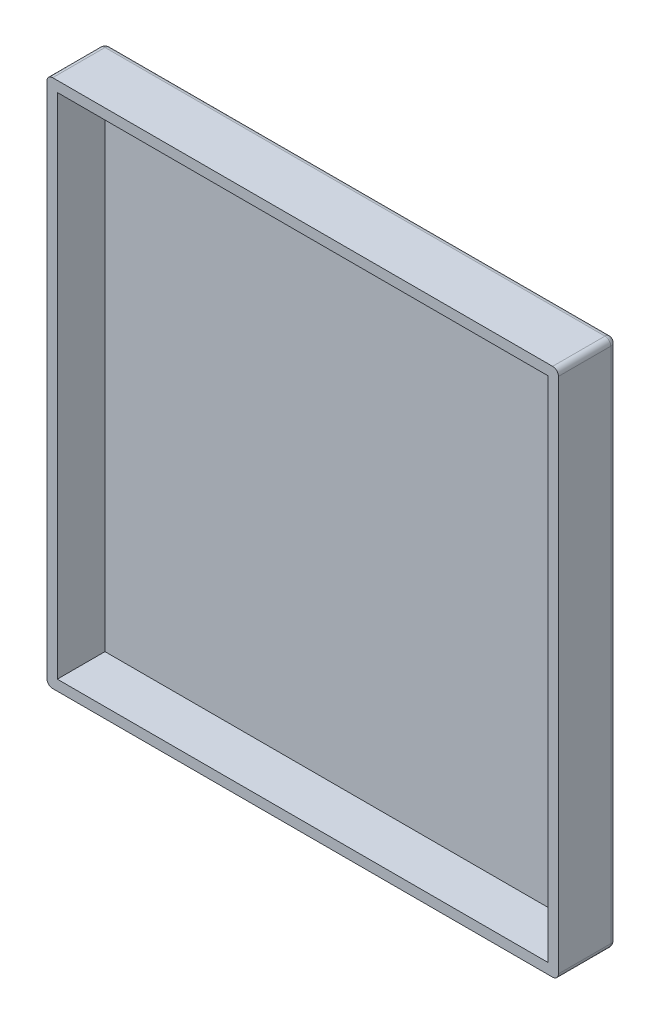
ISO-10303-21;
HEADER;
FILE_DESCRIPTION(('STEP AP214'),'2;1');
FILE_NAME('part.step','',(''),(''),'','','');
FILE_SCHEMA(('AUTOMOTIVE_DESIGN { 1 0 10303 214 1 1 1 1 }'));
ENDSEC;
DATA;
#1=APPLICATION_CONTEXT('core data for automotive mechanical design processes');
#2=APPLICATION_PROTOCOL_DEFINITION('international standard','automotive_design',2000,#1);
#3=PRODUCT_CONTEXT('',#1,'mechanical');
#4=PRODUCT('Part','Part','',(#3));
#5=PRODUCT_RELATED_PRODUCT_CATEGORY('part','',(#4));
#6=PRODUCT_DEFINITION_FORMATION('','',#4);
#7=PRODUCT_DEFINITION_CONTEXT('part definition',#1,'design');
#8=PRODUCT_DEFINITION('design','',#6,#7);
#9=PRODUCT_DEFINITION_SHAPE('','',#8);
#10=(LENGTH_UNIT() NAMED_UNIT(*) SI_UNIT(.MILLI.,.METRE.));
#11=(NAMED_UNIT(*) PLANE_ANGLE_UNIT() SI_UNIT($,.RADIAN.));
#12=(NAMED_UNIT(*) SI_UNIT($,.STERADIAN.) SOLID_ANGLE_UNIT());
#13=UNCERTAINTY_MEASURE_WITH_UNIT(LENGTH_MEASURE(1.E-05),#10,'distance_accuracy_value','');
#14=(GEOMETRIC_REPRESENTATION_CONTEXT(3) GLOBAL_UNCERTAINTY_ASSIGNED_CONTEXT((#13)) GLOBAL_UNIT_ASSIGNED_CONTEXT((#10,
#11,#12)) REPRESENTATION_CONTEXT('',''));
#15=CARTESIAN_POINT('',(0.,0.,0.));
#16=DIRECTION('',(0.,0.,1.));
#17=DIRECTION('',(1.,0.,0.));
#18=AXIS2_PLACEMENT_3D('',#15,#16,#17);
#19=CARTESIAN_POINT('',(0.,0.,10.));
#20=DIRECTION('',(0.,0.,-1.));
#21=DIRECTION('',(-1.,0.,0.));
#22=AXIS2_PLACEMENT_3D('',#19,#20,#21);
#23=PLANE('',#22);
#24=DIRECTION('',(-1.,0.,0.));
#25=VECTOR('',#24,1.);
#26=CARTESIAN_POINT('',(0.,91.,10.));
#27=LINE('',#26,#25);
#28=CARTESIAN_POINT('',(87.,91.,10.));
#29=VERTEX_POINT('',#28);
#30=CARTESIAN_POINT('',(1.,91.,10.));
#31=VERTEX_POINT('',#30);
#32=EDGE_CURVE('E180',#29,#31,#27,.T.);
#33=ORIENTED_EDGE('',*,*,#32,.T.);
#34=CARTESIAN_POINT('',(1.,90.,10.));
#35=DIRECTION('',(0.,0.,-1.));
#36=DIRECTION('',(-1.,0.,0.));
#37=AXIS2_PLACEMENT_3D('',#34,#35,#36);
#38=CIRCLE('',#37,1.);
#39=CARTESIAN_POINT('',(0.,90.,10.));
#40=VERTEX_POINT('',#39);
#41=EDGE_CURVE('E11',#31,#40,#38,.F.);
#42=ORIENTED_EDGE('',*,*,#41,.T.);
#43=DIRECTION('',(0.,-1.,0.));
#44=VECTOR('',#43,1.);
#45=CARTESIAN_POINT('',(0.,0.,10.));
#46=LINE('',#45,#44);
#47=CARTESIAN_POINT('',(0.,1.,10.));
#48=VERTEX_POINT('',#47);
#49=EDGE_CURVE('E171',#40,#48,#46,.T.);
#50=ORIENTED_EDGE('',*,*,#49,.T.);
#51=CARTESIAN_POINT('',(1.,1.,10.));
#52=DIRECTION('',(0.,0.,-1.));
#53=DIRECTION('',(-1.,0.,0.));
#54=AXIS2_PLACEMENT_3D('',#51,#52,#53);
#55=CIRCLE('',#54,1.);
#56=CARTESIAN_POINT('',(1.,0.,10.));
#57=VERTEX_POINT('',#56);
#58=EDGE_CURVE('E41',#48,#57,#55,.F.);
#59=ORIENTED_EDGE('',*,*,#58,.T.);
#60=DIRECTION('',(1.,0.,0.));
#61=VECTOR('',#60,1.);
#62=CARTESIAN_POINT('',(0.,0.,10.));
#63=LINE('',#62,#61);
#64=CARTESIAN_POINT('',(87.,0.,10.));
#65=VERTEX_POINT('',#64);
#66=EDGE_CURVE('E174',#57,#65,#63,.T.);
#67=ORIENTED_EDGE('',*,*,#66,.T.);
#68=CARTESIAN_POINT('',(87.,1.,10.));
#69=DIRECTION('',(0.,0.,-1.));
#70=DIRECTION('',(-1.,0.,0.));
#71=AXIS2_PLACEMENT_3D('',#68,#69,#70);
#72=CIRCLE('',#71,1.);
#73=CARTESIAN_POINT('',(88.,1.,10.));
#74=VERTEX_POINT('',#73);
#75=EDGE_CURVE('E217',#65,#74,#72,.F.);
#76=ORIENTED_EDGE('',*,*,#75,.T.);
#77=DIRECTION('',(0.,1.,0.));
#78=VECTOR('',#77,1.);
#79=CARTESIAN_POINT('',(88.,0.,10.));
#80=LINE('',#79,#78);
#81=CARTESIAN_POINT('',(88.,90.,10.));
#82=VERTEX_POINT('',#81);
#83=EDGE_CURVE('E177',#74,#82,#80,.T.);
#84=ORIENTED_EDGE('',*,*,#83,.T.);
#85=CARTESIAN_POINT('',(87.,90.,10.));
#86=DIRECTION('',(0.,0.,-1.));
#87=DIRECTION('',(-1.,0.,0.));
#88=AXIS2_PLACEMENT_3D('',#85,#86,#87);
#89=CIRCLE('',#88,1.);
#90=EDGE_CURVE('E215',#82,#29,#89,.F.);
#91=ORIENTED_EDGE('',*,*,#90,.T.);
#92=EDGE_LOOP('',(#33,#42,#50,#59,#67,#76,#84,#91));
#93=FACE_BOUND('',#92,.T.);
#94=DIRECTION('',(0.,-1.,0.));
#95=VECTOR('',#94,1.);
#96=CARTESIAN_POINT('',(1.8,0.,10.));
#97=LINE('',#96,#95);
#98=CARTESIAN_POINT('',(1.8,89.2,10.));
#99=VERTEX_POINT('',#98);
#100=CARTESIAN_POINT('',(1.8,1.8,10.));
#101=VERTEX_POINT('',#100);
#102=EDGE_CURVE('E160',#99,#101,#97,.T.);
#103=ORIENTED_EDGE('',*,*,#102,.F.);
#104=DIRECTION('',(-1.,0.,0.));
#105=VECTOR('',#104,1.);
#106=CARTESIAN_POINT('',(0.,89.2,10.));
#107=LINE('',#106,#105);
#108=CARTESIAN_POINT('',(86.2,89.2,10.));
#109=VERTEX_POINT('',#108);
#110=EDGE_CURVE('E169',#109,#99,#107,.T.);
#111=ORIENTED_EDGE('',*,*,#110,.F.);
#112=DIRECTION('',(0.,1.,0.));
#113=VECTOR('',#112,1.);
#114=CARTESIAN_POINT('',(86.2,0.,10.));
#115=LINE('',#114,#113);
#116=CARTESIAN_POINT('',(86.2,1.8,10.));
#117=VERTEX_POINT('',#116);
#118=EDGE_CURVE('E167',#117,#109,#115,.T.);
#119=ORIENTED_EDGE('',*,*,#118,.F.);
#120=DIRECTION('',(1.,0.,0.));
#121=VECTOR('',#120,1.);
#122=CARTESIAN_POINT('',(0.,1.8,10.));
#123=LINE('',#122,#121);
#124=EDGE_CURVE('E149',#101,#117,#123,.T.);
#125=ORIENTED_EDGE('',*,*,#124,.F.);
#126=EDGE_LOOP('',(#103,#111,#119,#125));
#127=FACE_BOUND('',#126,.T.);
#128=ADVANCED_FACE('F32',(#93,#127),#23,.F.);
#129=CARTESIAN_POINT('',(0.,0.,10.));
#130=DIRECTION('',(1.,0.,0.));
#131=DIRECTION('',(0.,0.,-1.));
#132=AXIS2_PLACEMENT_3D('',#129,#130,#131);
#133=PLANE('',#132);
#134=ORIENTED_EDGE('',*,*,#49,.F.);
#135=DIRECTION('',(0.,0.,-1.));
#136=VECTOR('',#135,1.);
#137=CARTESIAN_POINT('',(0.,90.,10.));
#138=LINE('',#137,#136);
#139=CARTESIAN_POINT('',(0.,90.,0.999999999999999));
#140=VERTEX_POINT('',#139);
#141=EDGE_CURVE('E49',#40,#140,#138,.T.);
#142=ORIENTED_EDGE('',*,*,#141,.T.);
#143=DIRECTION('',(0.,-1.,0.));
#144=VECTOR('',#143,1.);
#145=CARTESIAN_POINT('',(0.,0.,0.999999999999999));
#146=LINE('',#145,#144);
#147=CARTESIAN_POINT('',(0.,1.,0.999999999999999));
#148=VERTEX_POINT('',#147);
#149=EDGE_CURVE('E54',#140,#148,#146,.T.);
#150=ORIENTED_EDGE('',*,*,#149,.T.);
#151=DIRECTION('',(0.,0.,-1.));
#152=VECTOR('',#151,1.);
#153=CARTESIAN_POINT('',(0.,1.,10.));
#154=LINE('',#153,#152);
#155=EDGE_CURVE('E211',#148,#48,#154,.F.);
#156=ORIENTED_EDGE('',*,*,#155,.T.);
#157=EDGE_LOOP('',(#134,#142,#150,#156));
#158=FACE_BOUND('',#157,.T.);
#159=ADVANCED_FACE('F266',(#158),#133,.F.);
#160=CARTESIAN_POINT('',(0.,0.,10.));
#161=DIRECTION('',(0.,1.,0.));
#162=DIRECTION('',(0.,0.,1.));
#163=AXIS2_PLACEMENT_3D('',#160,#161,#162);
#164=PLANE('',#163);
#165=ORIENTED_EDGE('',*,*,#66,.F.);
#166=DIRECTION('',(0.,0.,-1.));
#167=VECTOR('',#166,1.);
#168=CARTESIAN_POINT('',(1.,0.,10.));
#169=LINE('',#168,#167);
#170=CARTESIAN_POINT('',(1.,0.,0.999999999999999));
#171=VERTEX_POINT('',#170);
#172=EDGE_CURVE('E188',#57,#171,#169,.T.);
#173=ORIENTED_EDGE('',*,*,#172,.T.);
#174=DIRECTION('',(1.,0.,0.));
#175=VECTOR('',#174,1.);
#176=CARTESIAN_POINT('',(88.,0.,0.999999999999999));
#177=LINE('',#176,#175);
#178=CARTESIAN_POINT('',(87.,0.,0.999999999999999));
#179=VERTEX_POINT('',#178);
#180=EDGE_CURVE('E185',#171,#179,#177,.T.);
#181=ORIENTED_EDGE('',*,*,#180,.T.);
#182=DIRECTION('',(0.,0.,-1.));
#183=VECTOR('',#182,1.);
#184=CARTESIAN_POINT('',(87.,0.,10.));
#185=LINE('',#184,#183);
#186=EDGE_CURVE('E183',#179,#65,#185,.F.);
#187=ORIENTED_EDGE('',*,*,#186,.T.);
#188=EDGE_LOOP('',(#165,#173,#181,#187));
#189=FACE_BOUND('',#188,.T.);
#190=ADVANCED_FACE('F272',(#189),#164,.F.);
#191=CARTESIAN_POINT('',(88.,0.,10.));
#192=DIRECTION('',(-1.,0.,0.));
#193=DIRECTION('',(0.,0.,1.));
#194=AXIS2_PLACEMENT_3D('',#191,#192,#193);
#195=PLANE('',#194);
#196=ORIENTED_EDGE('',*,*,#83,.F.);
#197=DIRECTION('',(0.,0.,-1.));
#198=VECTOR('',#197,1.);
#199=CARTESIAN_POINT('',(88.,1.,10.));
#200=LINE('',#199,#198);
#201=CARTESIAN_POINT('',(88.,1.,0.999999999999999));
#202=VERTEX_POINT('',#201);
#203=EDGE_CURVE('E203',#74,#202,#200,.T.);
#204=ORIENTED_EDGE('',*,*,#203,.T.);
#205=DIRECTION('',(0.,1.,0.));
#206=VECTOR('',#205,1.);
#207=CARTESIAN_POINT('',(88.,91.,0.999999999999999));
#208=LINE('',#207,#206);
#209=CARTESIAN_POINT('',(88.,90.,0.999999999999999));
#210=VERTEX_POINT('',#209);
#211=EDGE_CURVE('E201',#202,#210,#208,.T.);
#212=ORIENTED_EDGE('',*,*,#211,.T.);
#213=DIRECTION('',(0.,0.,-1.));
#214=VECTOR('',#213,1.);
#215=CARTESIAN_POINT('',(88.,90.,10.));
#216=LINE('',#215,#214);
#217=EDGE_CURVE('E199',#210,#82,#216,.F.);
#218=ORIENTED_EDGE('',*,*,#217,.T.);
#219=EDGE_LOOP('',(#196,#204,#212,#218));
#220=FACE_BOUND('',#219,.T.);
#221=ADVANCED_FACE('F284',(#220),#195,.F.);
#222=CARTESIAN_POINT('',(0.,91.,10.));
#223=DIRECTION('',(0.,-1.,0.));
#224=DIRECTION('',(0.,0.,-1.));
#225=AXIS2_PLACEMENT_3D('',#222,#223,#224);
#226=PLANE('',#225);
#227=DIRECTION('',(-1.,0.,0.));
#228=VECTOR('',#227,1.);
#229=CARTESIAN_POINT('',(0.,91.,0.999999999999999));
#230=LINE('',#229,#228);
#231=CARTESIAN_POINT('',(87.,91.,0.999999999999999));
#232=VERTEX_POINT('',#231);
#233=CARTESIAN_POINT('',(1.,91.,0.999999999999999));
#234=VERTEX_POINT('',#233);
#235=EDGE_CURVE('E207',#232,#234,#230,.T.);
#236=ORIENTED_EDGE('',*,*,#235,.T.);
#237=DIRECTION('',(0.,0.,-1.));
#238=VECTOR('',#237,1.);
#239=CARTESIAN_POINT('',(1.,91.,10.));
#240=LINE('',#239,#238);
#241=EDGE_CURVE('E209',#234,#31,#240,.F.);
#242=ORIENTED_EDGE('',*,*,#241,.T.);
#243=ORIENTED_EDGE('',*,*,#32,.F.);
#244=DIRECTION('',(0.,0.,-1.));
#245=VECTOR('',#244,1.);
#246=CARTESIAN_POINT('',(87.,91.,10.));
#247=LINE('',#246,#245);
#248=EDGE_CURVE('E205',#29,#232,#247,.T.);
#249=ORIENTED_EDGE('',*,*,#248,.T.);
#250=EDGE_LOOP('',(#236,#242,#243,#249));
#251=FACE_BOUND('',#250,.T.);
#252=ADVANCED_FACE('F280',(#251),#226,.F.);
#253=CARTESIAN_POINT('',(0.,0.,0.));
#254=DIRECTION('',(0.,0.,-1.));
#255=DIRECTION('',(-1.,0.,0.));
#256=AXIS2_PLACEMENT_3D('',#253,#254,#255);
#257=PLANE('',#256);
#258=DIRECTION('',(0.,1.,0.));
#259=VECTOR('',#258,1.);
#260=CARTESIAN_POINT('',(87.,0.,0.));
#261=LINE('',#260,#259);
#262=CARTESIAN_POINT('',(87.,90.,0.));
#263=VERTEX_POINT('',#262);
#264=CARTESIAN_POINT('',(87.,1.,0.));
#265=VERTEX_POINT('',#264);
#266=EDGE_CURVE('E194',#263,#265,#261,.F.);
#267=ORIENTED_EDGE('',*,*,#266,.T.);
#268=DIRECTION('',(1.,0.,0.));
#269=VECTOR('',#268,1.);
#270=CARTESIAN_POINT('',(0.,1.,0.));
#271=LINE('',#270,#269);
#272=CARTESIAN_POINT('',(1.,1.,0.));
#273=VERTEX_POINT('',#272);
#274=EDGE_CURVE('E196',#265,#273,#271,.F.);
#275=ORIENTED_EDGE('',*,*,#274,.T.);
#276=DIRECTION('',(0.,-1.,0.));
#277=VECTOR('',#276,1.);
#278=CARTESIAN_POINT('',(1.,91.,0.));
#279=LINE('',#278,#277);
#280=CARTESIAN_POINT('',(1.,90.,0.));
#281=VERTEX_POINT('',#280);
#282=EDGE_CURVE('E190',#273,#281,#279,.F.);
#283=ORIENTED_EDGE('',*,*,#282,.T.);
#284=DIRECTION('',(-1.,0.,0.));
#285=VECTOR('',#284,1.);
#286=CARTESIAN_POINT('',(88.,90.,0.));
#287=LINE('',#286,#285);
#288=EDGE_CURVE('E192',#281,#263,#287,.F.);
#289=ORIENTED_EDGE('',*,*,#288,.T.);
#290=EDGE_LOOP('',(#267,#275,#283,#289));
#291=FACE_BOUND('',#290,.T.);
#292=ADVANCED_FACE('F277',(#291),#257,.T.);
#293=CARTESIAN_POINT('',(1.8,0.,10.));
#294=DIRECTION('',(1.,0.,0.));
#295=DIRECTION('',(0.,0.,-1.));
#296=AXIS2_PLACEMENT_3D('',#293,#294,#295);
#297=PLANE('',#296);
#298=DIRECTION('',(0.,-1.,0.));
#299=VECTOR('',#298,1.);
#300=CARTESIAN_POINT('',(1.8,0.,1.8));
#301=LINE('',#300,#299);
#302=CARTESIAN_POINT('',(1.8,89.2,1.8));
#303=VERTEX_POINT('',#302);
#304=CARTESIAN_POINT('',(1.8,1.8,1.8));
#305=VERTEX_POINT('',#304);
#306=EDGE_CURVE('E140',#303,#305,#301,.T.);
#307=ORIENTED_EDGE('',*,*,#306,.F.);
#308=DIRECTION('',(0.,0.,-1.));
#309=VECTOR('',#308,1.);
#310=CARTESIAN_POINT('',(1.8,89.2,10.));
#311=LINE('',#310,#309);
#312=EDGE_CURVE('E163',#99,#303,#311,.T.);
#313=ORIENTED_EDGE('',*,*,#312,.F.);
#314=ORIENTED_EDGE('',*,*,#102,.T.);
#315=DIRECTION('',(0.,0.,-1.));
#316=VECTOR('',#315,1.);
#317=CARTESIAN_POINT('',(1.8,1.8,10.));
#318=LINE('',#317,#316);
#319=EDGE_CURVE('E153',#101,#305,#318,.T.);
#320=ORIENTED_EDGE('',*,*,#319,.T.);
#321=EDGE_LOOP('',(#307,#313,#314,#320));
#322=FACE_BOUND('',#321,.T.);
#323=ADVANCED_FACE('F263',(#322),#297,.T.);
#324=CARTESIAN_POINT('',(0.,1.8,10.));
#325=DIRECTION('',(0.,1.,0.));
#326=DIRECTION('',(0.,0.,1.));
#327=AXIS2_PLACEMENT_3D('',#324,#325,#326);
#328=PLANE('',#327);
#329=DIRECTION('',(1.,0.,0.));
#330=VECTOR('',#329,1.);
#331=CARTESIAN_POINT('',(0.,1.8,1.8));
#332=LINE('',#331,#330);
#333=CARTESIAN_POINT('',(86.2,1.8,1.8));
#334=VERTEX_POINT('',#333);
#335=EDGE_CURVE('E133',#305,#334,#332,.T.);
#336=ORIENTED_EDGE('',*,*,#335,.F.);
#337=ORIENTED_EDGE('',*,*,#319,.F.);
#338=ORIENTED_EDGE('',*,*,#124,.T.);
#339=DIRECTION('',(0.,0.,-1.));
#340=VECTOR('',#339,1.);
#341=CARTESIAN_POINT('',(86.2,1.8,10.));
#342=LINE('',#341,#340);
#343=EDGE_CURVE('E146',#117,#334,#342,.T.);
#344=ORIENTED_EDGE('',*,*,#343,.T.);
#345=EDGE_LOOP('',(#336,#337,#338,#344));
#346=FACE_BOUND('',#345,.T.);
#347=ADVANCED_FACE('F147',(#346),#328,.T.);
#348=CARTESIAN_POINT('',(86.2,0.,10.));
#349=DIRECTION('',(-1.,0.,0.));
#350=DIRECTION('',(0.,0.,1.));
#351=AXIS2_PLACEMENT_3D('',#348,#349,#350);
#352=PLANE('',#351);
#353=DIRECTION('',(0.,1.,0.));
#354=VECTOR('',#353,1.);
#355=CARTESIAN_POINT('',(86.2,0.,1.8));
#356=LINE('',#355,#354);
#357=CARTESIAN_POINT('',(86.2,89.2,1.8));
#358=VERTEX_POINT('',#357);
#359=EDGE_CURVE('E137',#334,#358,#356,.T.);
#360=ORIENTED_EDGE('',*,*,#359,.F.);
#361=ORIENTED_EDGE('',*,*,#343,.F.);
#362=ORIENTED_EDGE('',*,*,#118,.T.);
#363=DIRECTION('',(0.,0.,-1.));
#364=VECTOR('',#363,1.);
#365=CARTESIAN_POINT('',(86.2,89.2,10.));
#366=LINE('',#365,#364);
#367=EDGE_CURVE('E154',#109,#358,#366,.T.);
#368=ORIENTED_EDGE('',*,*,#367,.T.);
#369=EDGE_LOOP('',(#360,#361,#362,#368));
#370=FACE_BOUND('',#369,.T.);
#371=ADVANCED_FACE('F156',(#370),#352,.T.);
#372=CARTESIAN_POINT('',(0.,89.2,10.));
#373=DIRECTION('',(0.,-1.,0.));
#374=DIRECTION('',(0.,0.,-1.));
#375=AXIS2_PLACEMENT_3D('',#372,#373,#374);
#376=PLANE('',#375);
#377=DIRECTION('',(-1.,0.,0.));
#378=VECTOR('',#377,1.);
#379=CARTESIAN_POINT('',(0.,89.2,1.8));
#380=LINE('',#379,#378);
#381=EDGE_CURVE('E158',#358,#303,#380,.T.);
#382=ORIENTED_EDGE('',*,*,#381,.F.);
#383=ORIENTED_EDGE('',*,*,#367,.F.);
#384=ORIENTED_EDGE('',*,*,#110,.T.);
#385=ORIENTED_EDGE('',*,*,#312,.T.);
#386=EDGE_LOOP('',(#382,#383,#384,#385));
#387=FACE_BOUND('',#386,.T.);
#388=ADVANCED_FACE('F259',(#387),#376,.T.);
#389=CARTESIAN_POINT('',(0.,0.,1.8));
#390=DIRECTION('',(0.,0.,-1.));
#391=DIRECTION('',(-1.,0.,0.));
#392=AXIS2_PLACEMENT_3D('',#389,#390,#391);
#393=PLANE('',#392);
#394=ORIENTED_EDGE('',*,*,#306,.T.);
#395=ORIENTED_EDGE('',*,*,#335,.T.);
#396=ORIENTED_EDGE('',*,*,#359,.T.);
#397=ORIENTED_EDGE('',*,*,#381,.T.);
#398=EDGE_LOOP('',(#394,#395,#396,#397));
#399=FACE_BOUND('',#398,.T.);
#400=ADVANCED_FACE('F135',(#399),#393,.F.);
#401=CARTESIAN_POINT('',(1.,90.,10.));
#402=DIRECTION('',(0.,0.,-1.));
#403=DIRECTION('',(-1.,0.,0.));
#404=AXIS2_PLACEMENT_3D('',#401,#402,#403);
#405=CYLINDRICAL_SURFACE('',#404,1.);
#406=ORIENTED_EDGE('',*,*,#41,.F.);
#407=ORIENTED_EDGE('',*,*,#241,.F.);
#408=CARTESIAN_POINT('',(1.,90.,0.999999999999999));
#409=DIRECTION('',(0.,0.,-1.));
#410=DIRECTION('',(-1.,0.,0.));
#411=AXIS2_PLACEMENT_3D('',#408,#409,#410);
#412=CIRCLE('',#411,1.);
#413=EDGE_CURVE('E247',#140,#234,#412,.T.);
#414=ORIENTED_EDGE('',*,*,#413,.F.);
#415=ORIENTED_EDGE('',*,*,#141,.F.);
#416=EDGE_LOOP('',(#406,#407,#414,#415));
#417=FACE_BOUND('',#416,.T.);
#418=ADVANCED_FACE('F34',(#417),#405,.T.);
#419=CARTESIAN_POINT('',(87.,90.,10.));
#420=DIRECTION('',(0.,0.,-1.));
#421=DIRECTION('',(-1.,0.,0.));
#422=AXIS2_PLACEMENT_3D('',#419,#420,#421);
#423=CYLINDRICAL_SURFACE('',#422,1.);
#424=ORIENTED_EDGE('',*,*,#90,.F.);
#425=ORIENTED_EDGE('',*,*,#217,.F.);
#426=CARTESIAN_POINT('',(87.,90.,0.999999999999999));
#427=DIRECTION('',(0.,0.,-1.));
#428=DIRECTION('',(-1.,0.,0.));
#429=AXIS2_PLACEMENT_3D('',#426,#427,#428);
#430=CIRCLE('',#429,1.);
#431=EDGE_CURVE('E245',#232,#210,#430,.T.);
#432=ORIENTED_EDGE('',*,*,#431,.F.);
#433=ORIENTED_EDGE('',*,*,#248,.F.);
#434=EDGE_LOOP('',(#424,#425,#432,#433));
#435=FACE_BOUND('',#434,.T.);
#436=ADVANCED_FACE('F329',(#435),#423,.T.);
#437=CARTESIAN_POINT('',(0.,90.,0.999999999999999));
#438=DIRECTION('',(1.,0.,0.));
#439=DIRECTION('',(0.,0.,-1.));
#440=AXIS2_PLACEMENT_3D('',#437,#438,#439);
#441=CYLINDRICAL_SURFACE('',#440,1.);
#442=CARTESIAN_POINT('',(1.,90.,0.999999999999999));
#443=DIRECTION('',(-1.,0.,0.));
#444=DIRECTION('',(0.,0.,1.));
#445=AXIS2_PLACEMENT_3D('',#442,#443,#444);
#446=CIRCLE('',#445,1.);
#447=EDGE_CURVE('E36',#234,#281,#446,.T.);
#448=ORIENTED_EDGE('',*,*,#447,.F.);
#449=ORIENTED_EDGE('',*,*,#235,.F.);
#450=CARTESIAN_POINT('',(87.,90.,1.));
#451=DIRECTION('',(1.,0.,0.));
#452=DIRECTION('',(0.,0.,-1.));
#453=AXIS2_PLACEMENT_3D('',#450,#451,#452);
#454=CIRCLE('',#453,1.);
#455=EDGE_CURVE('E242',#263,#232,#454,.T.);
#456=ORIENTED_EDGE('',*,*,#455,.F.);
#457=ORIENTED_EDGE('',*,*,#288,.F.);
#458=EDGE_LOOP('',(#448,#449,#456,#457));
#459=FACE_BOUND('',#458,.T.);
#460=ADVANCED_FACE('F327',(#459),#441,.T.);
#461=CARTESIAN_POINT('',(1.,90.,1.));
#462=DIRECTION('',(0.,0.,1.));
#463=DIRECTION('',(1.,0.,0.));
#464=AXIS2_PLACEMENT_3D('',#461,#462,#463);
#465=SPHERICAL_SURFACE('',#464,1.);
#466=ORIENTED_EDGE('',*,*,#413,.T.);
#467=ORIENTED_EDGE('',*,*,#447,.T.);
#468=CARTESIAN_POINT('',(1.,90.,1.));
#469=DIRECTION('',(0.,1.,0.));
#470=DIRECTION('',(0.,0.,1.));
#471=AXIS2_PLACEMENT_3D('',#468,#469,#470);
#472=CIRCLE('',#471,1.);
#473=EDGE_CURVE('E239',#140,#281,#472,.F.);
#474=ORIENTED_EDGE('',*,*,#473,.F.);
#475=EDGE_LOOP('',(#466,#467,#474));
#476=FACE_BOUND('',#475,.T.);
#477=ADVANCED_FACE('F323',(#476),#465,.T.);
#478=CARTESIAN_POINT('',(87.,90.,1.));
#479=DIRECTION('',(0.,0.,1.));
#480=DIRECTION('',(1.,0.,0.));
#481=AXIS2_PLACEMENT_3D('',#478,#479,#480);
#482=SPHERICAL_SURFACE('',#481,1.);
#483=ORIENTED_EDGE('',*,*,#455,.T.);
#484=ORIENTED_EDGE('',*,*,#431,.T.);
#485=CARTESIAN_POINT('',(87.,90.,0.999999999999999));
#486=DIRECTION('',(0.,1.,0.));
#487=DIRECTION('',(0.,0.,1.));
#488=AXIS2_PLACEMENT_3D('',#485,#486,#487);
#489=CIRCLE('',#488,1.);
#490=EDGE_CURVE('E236',#263,#210,#489,.F.);
#491=ORIENTED_EDGE('',*,*,#490,.F.);
#492=EDGE_LOOP('',(#483,#484,#491));
#493=FACE_BOUND('',#492,.T.);
#494=ADVANCED_FACE('F319',(#493),#482,.T.);
#495=CARTESIAN_POINT('',(1.,0.,0.999999999999999));
#496=DIRECTION('',(0.,1.,0.));
#497=DIRECTION('',(0.,0.,1.));
#498=AXIS2_PLACEMENT_3D('',#495,#496,#497);
#499=CYLINDRICAL_SURFACE('',#498,1.);
#500=ORIENTED_EDGE('',*,*,#473,.T.);
#501=ORIENTED_EDGE('',*,*,#282,.F.);
#502=CARTESIAN_POINT('',(1.,1.,0.999999999999999));
#503=DIRECTION('',(0.,-1.,0.));
#504=DIRECTION('',(0.,0.,-1.));
#505=AXIS2_PLACEMENT_3D('',#502,#503,#504);
#506=CIRCLE('',#505,1.);
#507=EDGE_CURVE('E233',#148,#273,#506,.T.);
#508=ORIENTED_EDGE('',*,*,#507,.F.);
#509=ORIENTED_EDGE('',*,*,#149,.F.);
#510=EDGE_LOOP('',(#500,#501,#508,#509));
#511=FACE_BOUND('',#510,.T.);
#512=ADVANCED_FACE('F315',(#511),#499,.T.);
#513=CARTESIAN_POINT('',(1.,1.,10.));
#514=DIRECTION('',(0.,0.,-1.));
#515=DIRECTION('',(-1.,0.,0.));
#516=AXIS2_PLACEMENT_3D('',#513,#514,#515);
#517=CYLINDRICAL_SURFACE('',#516,1.);
#518=ORIENTED_EDGE('',*,*,#58,.F.);
#519=ORIENTED_EDGE('',*,*,#155,.F.);
#520=CARTESIAN_POINT('',(1.,1.,0.999999999999999));
#521=DIRECTION('',(0.,0.,-1.));
#522=DIRECTION('',(-1.,0.,0.));
#523=AXIS2_PLACEMENT_3D('',#520,#521,#522);
#524=CIRCLE('',#523,1.);
#525=EDGE_CURVE('E230',#171,#148,#524,.T.);
#526=ORIENTED_EDGE('',*,*,#525,.F.);
#527=ORIENTED_EDGE('',*,*,#172,.F.);
#528=EDGE_LOOP('',(#518,#519,#526,#527));
#529=FACE_BOUND('',#528,.T.);
#530=ADVANCED_FACE('F311',(#529),#517,.T.);
#531=CARTESIAN_POINT('',(87.,1.,10.));
#532=DIRECTION('',(0.,0.,-1.));
#533=DIRECTION('',(-1.,0.,0.));
#534=AXIS2_PLACEMENT_3D('',#531,#532,#533);
#535=CYLINDRICAL_SURFACE('',#534,1.);
#536=ORIENTED_EDGE('',*,*,#75,.F.);
#537=ORIENTED_EDGE('',*,*,#186,.F.);
#538=CARTESIAN_POINT('',(87.,1.,0.999999999999999));
#539=DIRECTION('',(0.,0.,-1.));
#540=DIRECTION('',(-1.,0.,0.));
#541=AXIS2_PLACEMENT_3D('',#538,#539,#540);
#542=CIRCLE('',#541,1.);
#543=EDGE_CURVE('E227',#202,#179,#542,.T.);
#544=ORIENTED_EDGE('',*,*,#543,.F.);
#545=ORIENTED_EDGE('',*,*,#203,.F.);
#546=EDGE_LOOP('',(#536,#537,#544,#545));
#547=FACE_BOUND('',#546,.T.);
#548=ADVANCED_FACE('F307',(#547),#535,.T.);
#549=CARTESIAN_POINT('',(87.,0.,0.999999999999999));
#550=DIRECTION('',(0.,-1.,0.));
#551=DIRECTION('',(0.,0.,-1.));
#552=AXIS2_PLACEMENT_3D('',#549,#550,#551);
#553=CYLINDRICAL_SURFACE('',#552,1.);
#554=ORIENTED_EDGE('',*,*,#490,.T.);
#555=ORIENTED_EDGE('',*,*,#211,.F.);
#556=CARTESIAN_POINT('',(87.,1.,1.));
#557=DIRECTION('',(0.,-1.,0.));
#558=DIRECTION('',(0.,0.,-1.));
#559=AXIS2_PLACEMENT_3D('',#556,#557,#558);
#560=CIRCLE('',#559,1.);
#561=EDGE_CURVE('E224',#265,#202,#560,.T.);
#562=ORIENTED_EDGE('',*,*,#561,.F.);
#563=ORIENTED_EDGE('',*,*,#266,.F.);
#564=EDGE_LOOP('',(#554,#555,#562,#563));
#565=FACE_BOUND('',#564,.T.);
#566=ADVANCED_FACE('F303',(#565),#553,.T.);
#567=CARTESIAN_POINT('',(1.,1.,1.));
#568=DIRECTION('',(0.,0.,1.));
#569=DIRECTION('',(1.,0.,0.));
#570=AXIS2_PLACEMENT_3D('',#567,#568,#569);
#571=SPHERICAL_SURFACE('',#570,1.);
#572=ORIENTED_EDGE('',*,*,#525,.T.);
#573=ORIENTED_EDGE('',*,*,#507,.T.);
#574=CARTESIAN_POINT('',(1.,1.,1.));
#575=DIRECTION('',(-1.,0.,0.));
#576=DIRECTION('',(0.,0.,1.));
#577=AXIS2_PLACEMENT_3D('',#574,#575,#576);
#578=CIRCLE('',#577,1.);
#579=EDGE_CURVE('E222',#171,#273,#578,.F.);
#580=ORIENTED_EDGE('',*,*,#579,.F.);
#581=EDGE_LOOP('',(#572,#573,#580));
#582=FACE_BOUND('',#581,.T.);
#583=ADVANCED_FACE('F299',(#582),#571,.T.);
#584=CARTESIAN_POINT('',(87.,1.,1.));
#585=DIRECTION('',(0.,0.,1.));
#586=DIRECTION('',(1.,0.,0.));
#587=AXIS2_PLACEMENT_3D('',#584,#585,#586);
#588=SPHERICAL_SURFACE('',#587,1.);
#589=ORIENTED_EDGE('',*,*,#561,.T.);
#590=ORIENTED_EDGE('',*,*,#543,.T.);
#591=CARTESIAN_POINT('',(87.,1.,0.999999999999999));
#592=DIRECTION('',(1.,0.,0.));
#593=DIRECTION('',(0.,0.,-1.));
#594=AXIS2_PLACEMENT_3D('',#591,#592,#593);
#595=CIRCLE('',#594,1.);
#596=EDGE_CURVE('E220',#265,#179,#595,.F.);
#597=ORIENTED_EDGE('',*,*,#596,.F.);
#598=EDGE_LOOP('',(#589,#590,#597));
#599=FACE_BOUND('',#598,.T.);
#600=ADVANCED_FACE('F295',(#599),#588,.T.);
#601=CARTESIAN_POINT('',(0.,1.,0.999999999999999));
#602=DIRECTION('',(-1.,0.,0.));
#603=DIRECTION('',(0.,0.,1.));
#604=AXIS2_PLACEMENT_3D('',#601,#602,#603);
#605=CYLINDRICAL_SURFACE('',#604,1.);
#606=ORIENTED_EDGE('',*,*,#579,.T.);
#607=ORIENTED_EDGE('',*,*,#274,.F.);
#608=ORIENTED_EDGE('',*,*,#596,.T.);
#609=ORIENTED_EDGE('',*,*,#180,.F.);
#610=EDGE_LOOP('',(#606,#607,#608,#609));
#611=FACE_BOUND('',#610,.T.);
#612=ADVANCED_FACE('F292',(#611),#605,.T.);
#613=CLOSED_SHELL('',(#128,#159,#190,#221,#252,#292,#323,#347,#371,#388,#400,#418,#436,#460,
#477,#494,#512,#530,#548,#566,#583,#600,#612));
#614=MANIFOLD_SOLID_BREP('B2',#613);
#615=ADVANCED_BREP_SHAPE_REPRESENTATION('',(#18,#614),#14);
#616=SHAPE_DEFINITION_REPRESENTATION(#9,#615);
ENDSEC;
END-ISO-10303-21;
